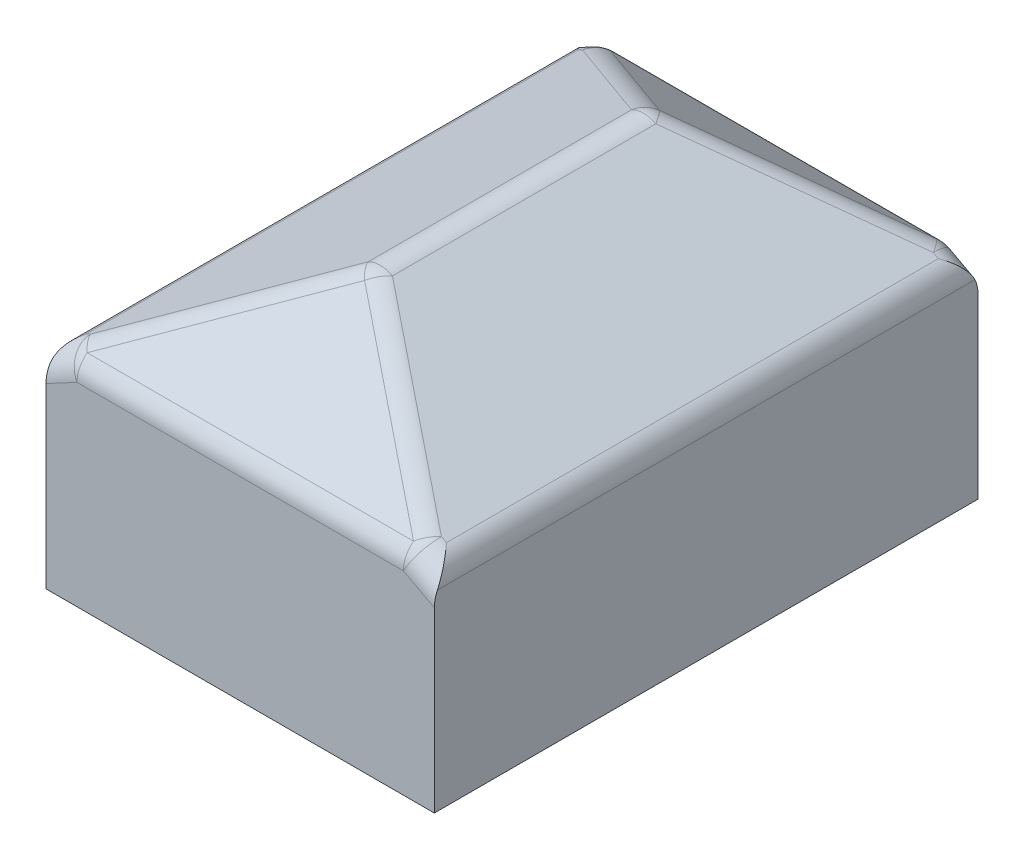
ISO-10303-21;
HEADER;
FILE_DESCRIPTION(('STEP AP214'),'2;1');
FILE_NAME('part.step','',(''),(''),'','','');
FILE_SCHEMA(('AUTOMOTIVE_DESIGN { 1 0 10303 214 1 1 1 1 }'));
ENDSEC;
DATA;
#1=APPLICATION_CONTEXT('core data for automotive mechanical design processes');
#2=APPLICATION_PROTOCOL_DEFINITION('international standard','automotive_design',2000,#1);
#3=PRODUCT_CONTEXT('',#1,'mechanical');
#4=PRODUCT('Part','Part','',(#3));
#5=PRODUCT_RELATED_PRODUCT_CATEGORY('part','',(#4));
#6=PRODUCT_DEFINITION_FORMATION('','',#4);
#7=PRODUCT_DEFINITION_CONTEXT('part definition',#1,'design');
#8=PRODUCT_DEFINITION('design','',#6,#7);
#9=PRODUCT_DEFINITION_SHAPE('','',#8);
#10=(LENGTH_UNIT() NAMED_UNIT(*) SI_UNIT(.MILLI.,.METRE.));
#11=(NAMED_UNIT(*) PLANE_ANGLE_UNIT() SI_UNIT($,.RADIAN.));
#12=(NAMED_UNIT(*) SI_UNIT($,.STERADIAN.) SOLID_ANGLE_UNIT());
#13=UNCERTAINTY_MEASURE_WITH_UNIT(LENGTH_MEASURE(1.E-05),#10,'distance_accuracy_value','');
#14=(GEOMETRIC_REPRESENTATION_CONTEXT(3) GLOBAL_UNCERTAINTY_ASSIGNED_CONTEXT((#13)) GLOBAL_UNIT_ASSIGNED_CONTEXT((#10,
#11,#12)) REPRESENTATION_CONTEXT('',''));
#15=CARTESIAN_POINT('',(0.,0.,0.));
#16=DIRECTION('',(0.,0.,1.));
#17=DIRECTION('',(1.,0.,0.));
#18=AXIS2_PLACEMENT_3D('',#15,#16,#17);
#19=CARTESIAN_POINT('',(75.,338.069758011279,-105.));
#20=DIRECTION('',(-1.,0.,0.));
#21=DIRECTION('',(0.,0.,1.));
#22=AXIS2_PLACEMENT_3D('',#19,#20,#21);
#23=PLANE('',#22);
#24=DIRECTION('',(0.,-1.,0.));
#25=VECTOR('',#24,1.);
#26=CARTESIAN_POINT('',(75.,338.069758011279,-105.));
#27=LINE('',#26,#25);
#28=CARTESIAN_POINT('',(75.,68.6666666666667,-105.));
#29=VERTEX_POINT('',#28);
#30=CARTESIAN_POINT('',(75.,0.,-105.));
#31=VERTEX_POINT('',#30);
#32=EDGE_CURVE('E186',#29,#31,#27,.T.);
#33=ORIENTED_EDGE('',*,*,#32,.F.);
#34=CARTESIAN_POINT('',(75.,68.6666666666667,-95.));
#35=DIRECTION('',(-1.,0.,0.));
#36=DIRECTION('',(0.,-1.,0.));
#37=AXIS2_PLACEMENT_3D('',#34,#35,#36);
#38=ELLIPSE('',#37,11.3333333333333,10.);
#39=CARTESIAN_POINT('',(75.,74.,-103.823529411765));
#40=VERTEX_POINT('',#39);
#41=EDGE_CURVE('E254',#29,#40,#38,.F.);
#42=ORIENTED_EDGE('',*,*,#41,.T.);
#43=DIRECTION('',(0.,0.,-1.));
#44=VECTOR('',#43,1.);
#45=CARTESIAN_POINT('',(75.,74.,-105.));
#46=LINE('',#45,#44);
#47=CARTESIAN_POINT('',(75.,74.,103.823529411765));
#48=VERTEX_POINT('',#47);
#49=EDGE_CURVE('E227',#40,#48,#46,.F.);
#50=ORIENTED_EDGE('',*,*,#49,.T.);
#51=CARTESIAN_POINT('',(75.,68.6666666666667,95.));
#52=DIRECTION('',(-1.,0.,0.));
#53=DIRECTION('',(0.,1.,0.));
#54=AXIS2_PLACEMENT_3D('',#51,#52,#53);
#55=ELLIPSE('',#54,11.3333333333333,10.);
#56=CARTESIAN_POINT('',(75.,68.6666666666667,105.));
#57=VERTEX_POINT('',#56);
#58=EDGE_CURVE('E167',#48,#57,#55,.F.);
#59=ORIENTED_EDGE('',*,*,#58,.T.);
#60=DIRECTION('',(0.,-1.,0.));
#61=VECTOR('',#60,1.);
#62=CARTESIAN_POINT('',(75.,338.069758011279,105.));
#63=LINE('',#62,#61);
#64=CARTESIAN_POINT('',(75.,0.,105.));
#65=VERTEX_POINT('',#64);
#66=EDGE_CURVE('E160',#57,#65,#63,.T.);
#67=ORIENTED_EDGE('',*,*,#66,.T.);
#68=DIRECTION('',(0.,0.,-1.));
#69=VECTOR('',#68,1.);
#70=CARTESIAN_POINT('',(75.,0.,-105.));
#71=LINE('',#70,#69);
#72=EDGE_CURVE('E164',#65,#31,#71,.T.);
#73=ORIENTED_EDGE('',*,*,#72,.T.);
#74=EDGE_LOOP('',(#33,#42,#50,#59,#67,#73));
#75=FACE_BOUND('',#74,.T.);
#76=ADVANCED_FACE('F39',(#75),#23,.F.);
#77=CARTESIAN_POINT('',(-75.,338.069758011279,-105.));
#78=DIRECTION('',(0.,0.,1.));
#79=DIRECTION('',(1.,0.,0.));
#80=AXIS2_PLACEMENT_3D('',#77,#78,#79);
#81=PLANE('',#80);
#82=DIRECTION('',(-1.,0.,0.));
#83=VECTOR('',#82,1.);
#84=CARTESIAN_POINT('',(68.6643447506093,75.0472583024342,-105.));
#85=LINE('',#84,#83);
#86=CARTESIAN_POINT('',(-63.0363906829358,75.0472583024342,-105.));
#87=VERTEX_POINT('',#86);
#88=CARTESIAN_POINT('',(63.0363906829359,75.0472583024342,-105.));
#89=VERTEX_POINT('',#88);
#90=EDGE_CURVE('E229',#87,#89,#85,.F.);
#91=ORIENTED_EDGE('',*,*,#90,.T.);
#92=DIRECTION('',(0.882352941176471,-0.470588235294118,0.));
#93=VECTOR('',#92,1.);
#94=CARTESIAN_POINT('',(-153.644882219216,190.610603850249,-105.));
#95=LINE('',#94,#93);
#96=EDGE_CURVE('E251',#89,#29,#95,.T.);
#97=ORIENTED_EDGE('',*,*,#96,.T.);
#98=ORIENTED_EDGE('',*,*,#32,.T.);
#99=DIRECTION('',(-1.,0.,0.));
#100=VECTOR('',#99,1.);
#101=CARTESIAN_POINT('',(-75.,0.,-105.));
#102=LINE('',#101,#100);
#103=CARTESIAN_POINT('',(-75.,0.,-105.));
#104=VERTEX_POINT('',#103);
#105=EDGE_CURVE('E185',#31,#104,#102,.T.);
#106=ORIENTED_EDGE('',*,*,#105,.T.);
#107=DIRECTION('',(0.,-1.,0.));
#108=VECTOR('',#107,1.);
#109=CARTESIAN_POINT('',(-75.,338.069758011279,-105.));
#110=LINE('',#109,#108);
#111=CARTESIAN_POINT('',(-75.,68.6666666666667,-105.));
#112=VERTEX_POINT('',#111);
#113=EDGE_CURVE('E192',#112,#104,#110,.T.);
#114=ORIENTED_EDGE('',*,*,#113,.F.);
#115=DIRECTION('',(0.882352941176471,0.470588235294118,0.));
#116=VECTOR('',#115,1.);
#117=CARTESIAN_POINT('',(36.8628752988009,128.326866826027,-105.));
#118=LINE('',#117,#116);
#119=EDGE_CURVE('E249',#112,#87,#118,.T.);
#120=ORIENTED_EDGE('',*,*,#119,.T.);
#121=EDGE_LOOP('',(#91,#97,#98,#106,#114,#120));
#122=FACE_BOUND('',#121,.T.);
#123=ADVANCED_FACE('F393',(#122),#81,.F.);
#124=CARTESIAN_POINT('',(-75.,338.069758011279,-105.));
#125=DIRECTION('',(1.,0.,0.));
#126=DIRECTION('',(0.,0.,-1.));
#127=AXIS2_PLACEMENT_3D('',#124,#125,#126);
#128=PLANE('',#127);
#129=DIRECTION('',(0.,0.,1.));
#130=VECTOR('',#129,1.);
#131=CARTESIAN_POINT('',(-75.,74.0000000000001,-105.));
#132=LINE('',#131,#130);
#133=CARTESIAN_POINT('',(-75.,74.0000000000001,103.823529411765));
#134=VERTEX_POINT('',#133);
#135=CARTESIAN_POINT('',(-75.,74.0000000000001,-103.823529411765));
#136=VERTEX_POINT('',#135);
#137=EDGE_CURVE('E214',#134,#136,#132,.F.);
#138=ORIENTED_EDGE('',*,*,#137,.T.);
#139=CARTESIAN_POINT('',(-75.,68.6666666666667,-95.));
#140=DIRECTION('',(1.,0.,0.));
#141=DIRECTION('',(0.,1.,0.));
#142=AXIS2_PLACEMENT_3D('',#139,#140,#141);
#143=ELLIPSE('',#142,11.3333333333333,10.);
#144=EDGE_CURVE('E279',#136,#112,#143,.F.);
#145=ORIENTED_EDGE('',*,*,#144,.T.);
#146=ORIENTED_EDGE('',*,*,#113,.T.);
#147=DIRECTION('',(0.,0.,1.));
#148=VECTOR('',#147,1.);
#149=CARTESIAN_POINT('',(-75.,0.,-105.));
#150=LINE('',#149,#148);
#151=CARTESIAN_POINT('',(-75.,0.,105.));
#152=VERTEX_POINT('',#151);
#153=EDGE_CURVE('E194',#104,#152,#150,.T.);
#154=ORIENTED_EDGE('',*,*,#153,.T.);
#155=DIRECTION('',(0.,-1.,0.));
#156=VECTOR('',#155,1.);
#157=CARTESIAN_POINT('',(-75.,338.069758011279,105.));
#158=LINE('',#157,#156);
#159=CARTESIAN_POINT('',(-75.,68.6666666666667,105.));
#160=VERTEX_POINT('',#159);
#161=EDGE_CURVE('E176',#160,#152,#158,.T.);
#162=ORIENTED_EDGE('',*,*,#161,.F.);
#163=CARTESIAN_POINT('',(-75.,68.6666666666667,95.));
#164=DIRECTION('',(1.,0.,0.));
#165=DIRECTION('',(0.,-1.,0.));
#166=AXIS2_PLACEMENT_3D('',#163,#164,#165);
#167=ELLIPSE('',#166,11.3333333333333,10.);
#168=EDGE_CURVE('E277',#160,#134,#167,.F.);
#169=ORIENTED_EDGE('',*,*,#168,.T.);
#170=EDGE_LOOP('',(#138,#145,#146,#154,#162,#169));
#171=FACE_BOUND('',#170,.T.);
#172=ADVANCED_FACE('F398',(#171),#128,.F.);
#173=CARTESIAN_POINT('',(-75.,338.069758011279,105.));
#174=DIRECTION('',(0.,0.,-1.));
#175=DIRECTION('',(-1.,0.,0.));
#176=AXIS2_PLACEMENT_3D('',#173,#174,#175);
#177=PLANE('',#176);
#178=DIRECTION('',(1.,0.,0.));
#179=VECTOR('',#178,1.);
#180=CARTESIAN_POINT('',(-75.,75.0472583024342,105.));
#181=LINE('',#180,#179);
#182=CARTESIAN_POINT('',(63.0363906829359,75.0472583024342,105.));
#183=VERTEX_POINT('',#182);
#184=CARTESIAN_POINT('',(-63.0363906829359,75.0472583024342,105.));
#185=VERTEX_POINT('',#184);
#186=EDGE_CURVE('E281',#183,#185,#181,.F.);
#187=ORIENTED_EDGE('',*,*,#186,.T.);
#188=DIRECTION('',(-0.882352941176471,-0.470588235294118,0.));
#189=VECTOR('',#188,1.);
#190=CARTESIAN_POINT('',(36.8628752988009,128.326866826027,105.));
#191=LINE('',#190,#189);
#192=EDGE_CURVE('E285',#185,#160,#191,.T.);
#193=ORIENTED_EDGE('',*,*,#192,.T.);
#194=ORIENTED_EDGE('',*,*,#161,.T.);
#195=DIRECTION('',(1.,0.,0.));
#196=VECTOR('',#195,1.);
#197=CARTESIAN_POINT('',(-75.,0.,105.));
#198=LINE('',#197,#196);
#199=EDGE_CURVE('E173',#152,#65,#198,.T.);
#200=ORIENTED_EDGE('',*,*,#199,.T.);
#201=ORIENTED_EDGE('',*,*,#66,.F.);
#202=DIRECTION('',(-0.882352941176471,0.470588235294118,0.));
#203=VECTOR('',#202,1.);
#204=CARTESIAN_POINT('',(-153.644882219216,190.610603850249,105.));
#205=LINE('',#204,#203);
#206=EDGE_CURVE('E283',#57,#183,#205,.T.);
#207=ORIENTED_EDGE('',*,*,#206,.T.);
#208=EDGE_LOOP('',(#187,#193,#194,#200,#201,#207));
#209=FACE_BOUND('',#208,.T.);
#210=ADVANCED_FACE('F174',(#209),#177,.F.);
#211=CARTESIAN_POINT('',(0.,0.,0.));
#212=DIRECTION('',(0.,1.,0.));
#213=DIRECTION('',(0.,0.,1.));
#214=AXIS2_PLACEMENT_3D('',#211,#212,#213);
#215=PLANE('',#214);
#216=ORIENTED_EDGE('',*,*,#72,.F.);
#217=ORIENTED_EDGE('',*,*,#199,.F.);
#218=ORIENTED_EDGE('',*,*,#153,.F.);
#219=ORIENTED_EDGE('',*,*,#105,.F.);
#220=EDGE_LOOP('',(#216,#217,#218,#219));
#221=FACE_BOUND('',#220,.T.);
#222=ADVANCED_FACE('F183',(#221),#215,.F.);
#223=CARTESIAN_POINT('',(75.,80.,284.448989903466));
#224=DIRECTION('',(-0.470588235294118,-0.88235294117647,0.));
#225=DIRECTION('',(0.882352941176471,-0.470588235294118,0.));
#226=AXIS2_PLACEMENT_3D('',#223,#224,#225);
#227=PLANE('',#226);
#228=DIRECTION('',(0.,0.,-1.));
#229=VECTOR('',#228,1.);
#230=CARTESIAN_POINT('',(69.7058823529412,82.8235294117647,284.448989903466));
#231=LINE('',#230,#229);
#232=CARTESIAN_POINT('',(69.7058823529412,82.8235294117647,95.));
#233=VERTEX_POINT('',#232);
#234=CARTESIAN_POINT('',(69.7058823529412,82.8235294117647,-95.));
#235=VERTEX_POINT('',#234);
#236=EDGE_CURVE('E222',#233,#235,#231,.T.);
#237=ORIENTED_EDGE('',*,*,#236,.T.);
#238=DIRECTION('',(0.882352941176471,-0.470588235294118,0.));
#239=VECTOR('',#238,1.);
#240=CARTESIAN_POINT('',(75.,80.,-95.));
#241=LINE('',#240,#239);
#242=CARTESIAN_POINT('',(67.7422730358771,83.8707877141989,-95.));
#243=VERTEX_POINT('',#242);
#244=EDGE_CURVE('E262',#235,#243,#241,.F.);
#245=ORIENTED_EDGE('',*,*,#244,.T.);
#246=DIRECTION('',(-0.750704115317023,0.400375528169079,0.525492880721916));
#247=VECTOR('',#246,1.);
#248=CARTESIAN_POINT('',(1.9407278702704,118.964945135856,-48.9389183840753));
#249=LINE('',#248,#247);
#250=CARTESIAN_POINT('',(4.70588235294117,117.490196078431,-50.8745265219448));
#251=VERTEX_POINT('',#250);
#252=EDGE_CURVE('E225',#243,#251,#249,.T.);
#253=ORIENTED_EDGE('',*,*,#252,.T.);
#254=DIRECTION('',(0.,0.,-1.));
#255=VECTOR('',#254,1.);
#256=CARTESIAN_POINT('',(4.70588235294117,117.490196078431,284.448989903466));
#257=LINE('',#256,#255);
#258=CARTESIAN_POINT('',(4.70588235294117,117.490196078431,50.8745265219449));
#259=VERTEX_POINT('',#258);
#260=EDGE_CURVE('E217',#251,#259,#257,.F.);
#261=ORIENTED_EDGE('',*,*,#260,.T.);
#262=DIRECTION('',(0.750704115317023,-0.400375528169079,0.525492880721916));
#263=VECTOR('',#262,1.);
#264=CARTESIAN_POINT('',(147.731500343147,41.209866483655,150.992459115089));
#265=LINE('',#264,#263);
#266=CARTESIAN_POINT('',(67.742273035877,83.8707877141989,95.));
#267=VERTEX_POINT('',#266);
#268=EDGE_CURVE('E219',#259,#267,#265,.T.);
#269=ORIENTED_EDGE('',*,*,#268,.T.);
#270=DIRECTION('',(-0.882352941176471,0.470588235294118,0.));
#271=VECTOR('',#270,1.);
#272=CARTESIAN_POINT('',(75.,80.,95.));
#273=LINE('',#272,#271);
#274=EDGE_CURVE('E260',#267,#233,#273,.F.);
#275=ORIENTED_EDGE('',*,*,#274,.T.);
#276=EDGE_LOOP('',(#237,#245,#253,#261,#269,#275));
#277=FACE_BOUND('',#276,.T.);
#278=ADVANCED_FACE('F320',(#277),#227,.F.);
#279=CARTESIAN_POINT('',(0.,120.,284.448989903466));
#280=DIRECTION('',(0.470588235294118,-0.882352941176471,0.));
#281=DIRECTION('',(0.882352941176471,0.470588235294118,0.));
#282=AXIS2_PLACEMENT_3D('',#279,#280,#281);
#283=PLANE('',#282);
#284=DIRECTION('',(-0.750704115317023,-0.400375528169079,-0.525492880721916));
#285=VECTOR('',#284,1.);
#286=CARTESIAN_POINT('',(-76.9407278702704,78.9649451358558,-101.438918384075));
#287=LINE('',#286,#285);
#288=CARTESIAN_POINT('',(-4.70588235294118,117.490196078431,-50.8745265219449));
#289=VERTEX_POINT('',#288);
#290=CARTESIAN_POINT('',(-67.742273035877,83.870787714199,-95.));
#291=VERTEX_POINT('',#290);
#292=EDGE_CURVE('E199',#289,#291,#287,.T.);
#293=ORIENTED_EDGE('',*,*,#292,.T.);
#294=DIRECTION('',(0.882352941176471,0.470588235294118,0.));
#295=VECTOR('',#294,1.);
#296=CARTESIAN_POINT('',(0.,120.,-95.));
#297=LINE('',#296,#295);
#298=CARTESIAN_POINT('',(-69.7058823529412,82.8235294117647,-95.));
#299=VERTEX_POINT('',#298);
#300=EDGE_CURVE('E271',#291,#299,#297,.F.);
#301=ORIENTED_EDGE('',*,*,#300,.T.);
#302=DIRECTION('',(0.,0.,1.));
#303=VECTOR('',#302,1.);
#304=CARTESIAN_POINT('',(-69.7058823529411,82.8235294117648,284.448989903466));
#305=LINE('',#304,#303);
#306=CARTESIAN_POINT('',(-69.7058823529412,82.8235294117648,95.));
#307=VERTEX_POINT('',#306);
#308=EDGE_CURVE('E202',#299,#307,#305,.T.);
#309=ORIENTED_EDGE('',*,*,#308,.T.);
#310=DIRECTION('',(-0.882352941176471,-0.470588235294118,0.));
#311=VECTOR('',#310,1.);
#312=CARTESIAN_POINT('',(0.,120.,95.));
#313=LINE('',#312,#311);
#314=CARTESIAN_POINT('',(-67.7422730358771,83.8707877141989,95.));
#315=VERTEX_POINT('',#314);
#316=EDGE_CURVE('E269',#307,#315,#313,.F.);
#317=ORIENTED_EDGE('',*,*,#316,.T.);
#318=DIRECTION('',(0.750704115317023,0.400375528169079,-0.525492880721916));
#319=VECTOR('',#318,1.);
#320=CARTESIAN_POINT('',(-93.4422079198532,70.1641557760783,112.989954418783));
#321=LINE('',#320,#319);
#322=CARTESIAN_POINT('',(-4.70588235294118,117.490196078431,50.8745265219449));
#323=VERTEX_POINT('',#322);
#324=EDGE_CURVE('E197',#315,#323,#321,.T.);
#325=ORIENTED_EDGE('',*,*,#324,.T.);
#326=DIRECTION('',(0.,0.,-1.));
#327=VECTOR('',#326,1.);
#328=CARTESIAN_POINT('',(-4.70588235294118,117.490196078431,284.448989903466));
#329=LINE('',#328,#327);
#330=EDGE_CURVE('E180',#323,#289,#329,.T.);
#331=ORIENTED_EDGE('',*,*,#330,.T.);
#332=EDGE_LOOP('',(#293,#301,#309,#317,#325,#331));
#333=FACE_BOUND('',#332,.T.);
#334=ADVANCED_FACE('F366',(#333),#283,.F.);
#335=CARTESIAN_POINT('',(0.,101.233859397418,77.1305595408895));
#336=DIRECTION('',(0.,-0.795431720032499,-0.606043215262856));
#337=DIRECTION('',(0.,0.606043215262856,-0.795431720032499));
#338=AXIS2_PLACEMENT_3D('',#335,#336,#337);
#339=PLANE('',#338);
#340=DIRECTION('',(0.750704115317023,0.400375528169079,-0.525492880721916));
#341=VECTOR('',#340,1.);
#342=CARTESIAN_POINT('',(-12.5917647408733,109.905376005193,65.7491939931848));
#343=LINE('',#342,#341);
#344=CARTESIAN_POINT('',(0.,116.620983866992,56.9349586745734));
#345=VERTEX_POINT('',#344);
#346=CARTESIAN_POINT('',(-63.0363906829359,83.0015755027592,101.060432152629));
#347=VERTEX_POINT('',#346);
#348=EDGE_CURVE('E212',#345,#347,#343,.F.);
#349=ORIENTED_EDGE('',*,*,#348,.T.);
#350=DIRECTION('',(1.,0.,0.));
#351=VECTOR('',#350,1.);
#352=CARTESIAN_POINT('',(0.,83.0015755027592,101.060432152629));
#353=LINE('',#352,#351);
#354=CARTESIAN_POINT('',(63.0363906829359,83.0015755027592,101.060432152629));
#355=VERTEX_POINT('',#354);
#356=EDGE_CURVE('E11',#347,#355,#353,.T.);
#357=ORIENTED_EDGE('',*,*,#356,.T.);
#358=DIRECTION('',(0.750704115317023,-0.400375528169079,0.525492880721916));
#359=VECTOR('',#358,1.);
#360=CARTESIAN_POINT('',(12.5917647408733,109.905376005193,65.7491939931848));
#361=LINE('',#360,#359);
#362=EDGE_CURVE('E210',#355,#345,#361,.F.);
#363=ORIENTED_EDGE('',*,*,#362,.T.);
#364=EDGE_LOOP('',(#349,#357,#363));
#365=FACE_BOUND('',#364,.T.);
#366=ADVANCED_FACE('F560',(#365),#339,.F.);
#367=CARTESIAN_POINT('',(0.,101.233859397418,-77.1305595408895));
#368=DIRECTION('',(0.,0.795431720032499,-0.606043215262856));
#369=DIRECTION('',(0.,0.606043215262856,0.795431720032499));
#370=AXIS2_PLACEMENT_3D('',#367,#368,#369);
#371=PLANE('',#370);
#372=DIRECTION('',(-0.750704115317023,0.400375528169079,0.525492880721916));
#373=VECTOR('',#372,1.);
#374=CARTESIAN_POINT('',(72.2348455173292,78.0957329244161,-107.499350536704));
#375=LINE('',#374,#373);
#376=CARTESIAN_POINT('',(0.,116.620983866992,-56.9349586745735));
#377=VERTEX_POINT('',#376);
#378=CARTESIAN_POINT('',(63.0363906829359,83.0015755027592,-101.060432152629));
#379=VERTEX_POINT('',#378);
#380=EDGE_CURVE('E205',#377,#379,#375,.F.);
#381=ORIENTED_EDGE('',*,*,#380,.T.);
#382=DIRECTION('',(-1.,0.,0.));
#383=VECTOR('',#382,1.);
#384=CARTESIAN_POINT('',(-68.6643447506093,83.0015755027592,-101.060432152629));
#385=LINE('',#384,#383);
#386=CARTESIAN_POINT('',(-63.0363906829358,83.0015755027592,-101.060432152629));
#387=VERTEX_POINT('',#386);
#388=EDGE_CURVE('E48',#379,#387,#385,.T.);
#389=ORIENTED_EDGE('',*,*,#388,.T.);
#390=DIRECTION('',(-0.750704115317023,-0.400375528169079,-0.525492880721916));
#391=VECTOR('',#390,1.);
#392=CARTESIAN_POINT('',(2.76515448267084,118.095732924416,-54.9993505367039));
#393=LINE('',#392,#391);
#394=EDGE_CURVE('E208',#387,#377,#393,.F.);
#395=ORIENTED_EDGE('',*,*,#394,.T.);
#396=EDGE_LOOP('',(#381,#389,#395));
#397=FACE_BOUND('',#396,.T.);
#398=ADVANCED_FACE('F349',(#397),#371,.T.);
#399=CARTESIAN_POINT('',(143.025617990206,32.3863370718903,150.992459115089));
#400=DIRECTION('',(0.750704115317023,-0.400375528169079,0.525492880721916));
#401=DIRECTION('',(0.573462344363328,0.,-0.819231920519041));
#402=AXIS2_PLACEMENT_3D('',#399,#400,#401);
#403=CYLINDRICAL_SURFACE('',#402,10.);
#404=ORIENTED_EDGE('',*,*,#362,.F.);
#405=CARTESIAN_POINT('',(63.0363906829359,75.0472583024342,95.));
#406=DIRECTION('',(0.750704115317023,-0.400375528169079,0.525492880721916));
#407=DIRECTION('',(0.573462344363328,0.,-0.819231920519041));
#408=AXIS2_PLACEMENT_3D('',#405,#406,#407);
#409=CIRCLE('',#408,10.);
#410=EDGE_CURVE('E290',#355,#267,#409,.F.);
#411=ORIENTED_EDGE('',*,*,#410,.T.);
#412=ORIENTED_EDGE('',*,*,#268,.F.);
#413=CARTESIAN_POINT('',(0.,108.666666666667,50.8745265219449));
#414=DIRECTION('',(-0.75070411531702,0.400375528169081,-0.525492880721918));
#415=DIRECTION('',(-0.573462344363331,0.,0.819231920519038));
#416=AXIS2_PLACEMENT_3D('',#413,#414,#415);
#417=CIRCLE('',#416,10.);
#418=EDGE_CURVE('E170',#345,#259,#417,.T.);
#419=ORIENTED_EDGE('',*,*,#418,.F.);
#420=EDGE_LOOP('',(#404,#411,#412,#419));
#421=FACE_BOUND('',#420,.T.);
#422=ADVANCED_FACE('F425',(#421),#403,.T.);
#423=CARTESIAN_POINT('',(65.,74.,284.448989903466));
#424=DIRECTION('',(0.,0.,-1.));
#425=DIRECTION('',(-1.,0.,0.));
#426=AXIS2_PLACEMENT_3D('',#423,#424,#425);
#427=CYLINDRICAL_SURFACE('',#426,10.);
#428=ORIENTED_EDGE('',*,*,#49,.F.);
#429=CARTESIAN_POINT('',(65.,74.,-95.));
#430=DIRECTION('',(-0.623917748105777,0.332756132323081,-0.707106781186547));
#431=DIRECTION('',(0.623917748105777,-0.332756132323081,-0.707106781186547));
#432=AXIS2_PLACEMENT_3D('',#429,#430,#431);
#433=ELLIPSE('',#432,14.1421356237309,10.);
#434=EDGE_CURVE('E258',#40,#235,#433,.F.);
#435=ORIENTED_EDGE('',*,*,#434,.T.);
#436=ORIENTED_EDGE('',*,*,#236,.F.);
#437=CARTESIAN_POINT('',(65.,74.,95.));
#438=DIRECTION('',(0.623917748105777,-0.332756132323081,-0.707106781186547));
#439=DIRECTION('',(-0.623917748105777,0.332756132323081,-0.707106781186547));
#440=AXIS2_PLACEMENT_3D('',#437,#438,#439);
#441=ELLIPSE('',#440,14.1421356237309,10.);
#442=EDGE_CURVE('E256',#233,#48,#441,.T.);
#443=ORIENTED_EDGE('',*,*,#442,.T.);
#444=EDGE_LOOP('',(#428,#435,#436,#443));
#445=FACE_BOUND('',#444,.T.);
#446=ADVANCED_FACE('F325',(#445),#427,.T.);
#447=CARTESIAN_POINT('',(0.,108.666666666667,50.8745265219449));
#448=DIRECTION('',(0.,0.,1.));
#449=DIRECTION('',(1.,0.,0.));
#450=AXIS2_PLACEMENT_3D('',#447,#448,#449);
#451=SPHERICAL_SURFACE('',#450,10.);
#452=CARTESIAN_POINT('',(0.,108.666666666667,50.8745265219449));
#453=DIRECTION('',(0.750704115317023,0.400375528169079,-0.525492880721915));
#454=DIRECTION('',(-0.573462344363328,0.,-0.819231920519041));
#455=AXIS2_PLACEMENT_3D('',#452,#453,#454);
#456=CIRCLE('',#455,10.);
#457=EDGE_CURVE('E240',#345,#323,#456,.F.);
#458=ORIENTED_EDGE('',*,*,#457,.F.);
#459=ORIENTED_EDGE('',*,*,#418,.T.);
#460=CARTESIAN_POINT('',(0.,108.666666666667,50.8745265219449));
#461=DIRECTION('',(0.,0.,1.));
#462=DIRECTION('',(1.,0.,0.));
#463=AXIS2_PLACEMENT_3D('',#460,#461,#462);
#464=CIRCLE('',#463,10.);
#465=EDGE_CURVE('E243',#323,#259,#464,.F.);
#466=ORIENTED_EDGE('',*,*,#465,.F.);
#467=EDGE_LOOP('',(#458,#459,#466));
#468=FACE_BOUND('',#467,.T.);
#469=ADVANCED_FACE('F419',(#468),#451,.T.);
#470=CARTESIAN_POINT('',(-81.3987572623727,152.079337206599,6.10460356171605));
#471=DIRECTION('',(0.750704115317023,-0.400375528169079,-0.525492880721916));
#472=DIRECTION('',(-0.573462344363329,0.,-0.81923192051904));
#473=AXIS2_PLACEMENT_3D('',#470,#471,#472);
#474=CYLINDRICAL_SURFACE('',#473,10.);
#475=ORIENTED_EDGE('',*,*,#252,.F.);
#476=CARTESIAN_POINT('',(63.0363906829359,75.0472583024342,-95.));
#477=DIRECTION('',(0.750704115317023,-0.400375528169079,-0.525492880721916));
#478=DIRECTION('',(-0.573462344363329,0.,-0.81923192051904));
#479=AXIS2_PLACEMENT_3D('',#476,#477,#478);
#480=CIRCLE('',#479,10.);
#481=EDGE_CURVE('E264',#243,#379,#480,.F.);
#482=ORIENTED_EDGE('',*,*,#481,.T.);
#483=ORIENTED_EDGE('',*,*,#380,.F.);
#484=CARTESIAN_POINT('',(0.,108.666666666667,-50.8745265219448));
#485=DIRECTION('',(-0.750704115317028,0.400375528169082,0.525492880721905));
#486=DIRECTION('',(0.573462344363318,0.,0.819231920519048));
#487=AXIS2_PLACEMENT_3D('',#484,#485,#486);
#488=CIRCLE('',#487,10.);
#489=EDGE_CURVE('E237',#251,#377,#488,.T.);
#490=ORIENTED_EDGE('',*,*,#489,.F.);
#491=EDGE_LOOP('',(#475,#482,#483,#490));
#492=FACE_BOUND('',#491,.T.);
#493=ADVANCED_FACE('F336',(#492),#474,.T.);
#494=CARTESIAN_POINT('',(0.,108.666666666667,284.448989903466));
#495=DIRECTION('',(0.,0.,-1.));
#496=DIRECTION('',(-1.,0.,0.));
#497=AXIS2_PLACEMENT_3D('',#494,#495,#496);
#498=CYLINDRICAL_SURFACE('',#497,10.);
#499=ORIENTED_EDGE('',*,*,#465,.T.);
#500=ORIENTED_EDGE('',*,*,#260,.F.);
#501=CARTESIAN_POINT('',(0.,108.666666666667,-50.8745265219449));
#502=DIRECTION('',(0.,0.,-1.));
#503=DIRECTION('',(-1.,0.,0.));
#504=AXIS2_PLACEMENT_3D('',#501,#502,#503);
#505=CIRCLE('',#504,10.);
#506=EDGE_CURVE('E233',#289,#251,#505,.T.);
#507=ORIENTED_EDGE('',*,*,#506,.F.);
#508=ORIENTED_EDGE('',*,*,#330,.F.);
#509=EDGE_LOOP('',(#499,#500,#507,#508));
#510=FACE_BOUND('',#509,.T.);
#511=ADVANCED_FACE('F413',(#510),#498,.T.);
#512=CARTESIAN_POINT('',(-88.7363255669121,61.3406263643136,112.989954418783));
#513=DIRECTION('',(0.750704115317023,0.400375528169079,-0.525492880721916));
#514=DIRECTION('',(-0.573462344363328,0.,-0.819231920519041));
#515=AXIS2_PLACEMENT_3D('',#512,#513,#514);
#516=CYLINDRICAL_SURFACE('',#515,10.);
#517=ORIENTED_EDGE('',*,*,#324,.F.);
#518=CARTESIAN_POINT('',(-63.0363906829359,75.0472583024342,95.));
#519=DIRECTION('',(0.750704115317023,0.400375528169079,-0.525492880721916));
#520=DIRECTION('',(-0.573462344363328,0.,-0.819231920519041));
#521=AXIS2_PLACEMENT_3D('',#518,#519,#520);
#522=CIRCLE('',#521,10.);
#523=EDGE_CURVE('E287',#315,#347,#522,.T.);
#524=ORIENTED_EDGE('',*,*,#523,.T.);
#525=ORIENTED_EDGE('',*,*,#348,.F.);
#526=ORIENTED_EDGE('',*,*,#457,.T.);
#527=EDGE_LOOP('',(#517,#524,#525,#526));
#528=FACE_BOUND('',#527,.T.);
#529=ADVANCED_FACE('F379',(#528),#516,.T.);
#530=CARTESIAN_POINT('',(0.,108.666666666667,-50.8745265219449));
#531=DIRECTION('',(0.,0.,1.));
#532=DIRECTION('',(1.,0.,0.));
#533=AXIS2_PLACEMENT_3D('',#530,#531,#532);
#534=SPHERICAL_SURFACE('',#533,10.);
#535=ORIENTED_EDGE('',*,*,#506,.T.);
#536=ORIENTED_EDGE('',*,*,#489,.T.);
#537=CARTESIAN_POINT('',(0.,108.666666666667,-50.8745265219449));
#538=DIRECTION('',(0.750704115317016,0.400375528169084,0.525492880721922));
#539=DIRECTION('',(0.573462344363336,0.,-0.819231920519035));
#540=AXIS2_PLACEMENT_3D('',#537,#538,#539);
#541=CIRCLE('',#540,10.);
#542=EDGE_CURVE('E230',#289,#377,#541,.F.);
#543=ORIENTED_EDGE('',*,*,#542,.F.);
#544=EDGE_LOOP('',(#535,#536,#543));
#545=FACE_BOUND('',#544,.T.);
#546=ADVANCED_FACE('F407',(#545),#534,.T.);
#547=CARTESIAN_POINT('',(-65.,74.0000000000001,284.448989903466));
#548=DIRECTION('',(0.,0.,1.));
#549=DIRECTION('',(1.,0.,0.));
#550=AXIS2_PLACEMENT_3D('',#547,#548,#549);
#551=CYLINDRICAL_SURFACE('',#550,10.);
#552=ORIENTED_EDGE('',*,*,#308,.F.);
#553=CARTESIAN_POINT('',(-65.,74.,-94.9999999999999));
#554=DIRECTION('',(-0.623917748105777,-0.332756132323081,0.707106781186547));
#555=DIRECTION('',(0.623917748105777,0.332756132323081,0.707106781186547));
#556=AXIS2_PLACEMENT_3D('',#553,#554,#555);
#557=ELLIPSE('',#556,14.142135623731,10.);
#558=EDGE_CURVE('E275',#299,#136,#557,.T.);
#559=ORIENTED_EDGE('',*,*,#558,.T.);
#560=ORIENTED_EDGE('',*,*,#137,.F.);
#561=CARTESIAN_POINT('',(-65.,74.,95.0000000000001));
#562=DIRECTION('',(0.623917748105777,0.332756132323081,0.707106781186547));
#563=DIRECTION('',(-0.623917748105777,-0.332756132323081,0.707106781186547));
#564=AXIS2_PLACEMENT_3D('',#561,#562,#563);
#565=ELLIPSE('',#564,14.1421356237309,10.);
#566=EDGE_CURVE('E273',#134,#307,#565,.F.);
#567=ORIENTED_EDGE('',*,*,#566,.T.);
#568=EDGE_LOOP('',(#552,#559,#560,#567));
#569=FACE_BOUND('',#568,.T.);
#570=ADVANCED_FACE('F369',(#569),#551,.T.);
#571=CARTESIAN_POINT('',(135.688049685666,181.033626499022,44.1071082580215));
#572=DIRECTION('',(0.750704115317023,0.400375528169079,0.525492880721916));
#573=DIRECTION('',(0.573462344363328,0.,-0.819231920519041));
#574=AXIS2_PLACEMENT_3D('',#571,#572,#573);
#575=CYLINDRICAL_SURFACE('',#574,10.);
#576=ORIENTED_EDGE('',*,*,#394,.F.);
#577=CARTESIAN_POINT('',(-63.0363906829358,75.0472583024342,-95.));
#578=DIRECTION('',(0.750704115317023,0.400375528169079,0.525492880721916));
#579=DIRECTION('',(0.573462344363328,0.,-0.819231920519041));
#580=AXIS2_PLACEMENT_3D('',#577,#578,#579);
#581=CIRCLE('',#580,10.);
#582=EDGE_CURVE('E267',#387,#291,#581,.T.);
#583=ORIENTED_EDGE('',*,*,#582,.T.);
#584=ORIENTED_EDGE('',*,*,#292,.F.);
#585=ORIENTED_EDGE('',*,*,#542,.T.);
#586=EDGE_LOOP('',(#576,#583,#584,#585));
#587=FACE_BOUND('',#586,.T.);
#588=ADVANCED_FACE('F352',(#587),#575,.T.);
#589=CARTESIAN_POINT('',(36.8628752988009,128.326866826027,-95.));
#590=DIRECTION('',(0.882352941176471,0.470588235294118,0.));
#591=DIRECTION('',(-0.470588235294118,0.882352941176471,0.));
#592=AXIS2_PLACEMENT_3D('',#589,#590,#591);
#593=CYLINDRICAL_SURFACE('',#592,10.);
#594=ORIENTED_EDGE('',*,*,#558,.F.);
#595=ORIENTED_EDGE('',*,*,#300,.F.);
#596=CARTESIAN_POINT('',(-63.0363906829359,75.0472583024342,-95.));
#597=DIRECTION('',(0.882352941176471,0.470588235294116,0.));
#598=DIRECTION('',(-0.470588235294116,0.882352941176471,0.));
#599=AXIS2_PLACEMENT_3D('',#596,#597,#598);
#600=CIRCLE('',#599,10.);
#601=EDGE_CURVE('E234',#87,#291,#600,.T.);
#602=ORIENTED_EDGE('',*,*,#601,.F.);
#603=ORIENTED_EDGE('',*,*,#119,.F.);
#604=ORIENTED_EDGE('',*,*,#144,.F.);
#605=EDGE_LOOP('',(#594,#595,#602,#603,#604));
#606=FACE_BOUND('',#605,.T.);
#607=ADVANCED_FACE('F362',(#606),#593,.T.);
#608=CARTESIAN_POINT('',(-63.0363906829358,75.0472583024342,-95.));
#609=DIRECTION('',(0.,0.,1.));
#610=DIRECTION('',(1.,0.,0.));
#611=AXIS2_PLACEMENT_3D('',#608,#609,#610);
#612=SPHERICAL_SURFACE('',#611,10.);
#613=ORIENTED_EDGE('',*,*,#601,.T.);
#614=ORIENTED_EDGE('',*,*,#582,.F.);
#615=CARTESIAN_POINT('',(-63.0363906829358,75.0472583024342,-95.));
#616=DIRECTION('',(1.,0.,0.));
#617=DIRECTION('',(0.,0.,-1.));
#618=AXIS2_PLACEMENT_3D('',#615,#616,#617);
#619=CIRCLE('',#618,10.);
#620=EDGE_CURVE('E298',#87,#387,#619,.T.);
#621=ORIENTED_EDGE('',*,*,#620,.F.);
#622=EDGE_LOOP('',(#613,#614,#621));
#623=FACE_BOUND('',#622,.T.);
#624=ADVANCED_FACE('F356',(#623),#612,.T.);
#625=CARTESIAN_POINT('',(0.,75.0472583024342,-95.));
#626=DIRECTION('',(1.,0.,0.));
#627=DIRECTION('',(0.,0.,-1.));
#628=AXIS2_PLACEMENT_3D('',#625,#626,#627);
#629=CYLINDRICAL_SURFACE('',#628,10.);
#630=ORIENTED_EDGE('',*,*,#620,.T.);
#631=ORIENTED_EDGE('',*,*,#388,.F.);
#632=CARTESIAN_POINT('',(63.0363906829359,75.0472583024342,-95.));
#633=DIRECTION('',(1.,0.,0.));
#634=DIRECTION('',(0.,0.,-1.));
#635=AXIS2_PLACEMENT_3D('',#632,#633,#634);
#636=CIRCLE('',#635,10.);
#637=EDGE_CURVE('E296',#89,#379,#636,.T.);
#638=ORIENTED_EDGE('',*,*,#637,.F.);
#639=ORIENTED_EDGE('',*,*,#90,.F.);
#640=EDGE_LOOP('',(#630,#631,#638,#639));
#641=FACE_BOUND('',#640,.T.);
#642=ADVANCED_FACE('F345',(#641),#629,.T.);
#643=CARTESIAN_POINT('',(-153.644882219216,190.610603850249,-95.));
#644=DIRECTION('',(0.882352941176471,-0.470588235294118,0.));
#645=DIRECTION('',(0.470588235294118,0.882352941176471,0.));
#646=AXIS2_PLACEMENT_3D('',#643,#644,#645);
#647=CYLINDRICAL_SURFACE('',#646,10.);
#648=ORIENTED_EDGE('',*,*,#41,.F.);
#649=ORIENTED_EDGE('',*,*,#96,.F.);
#650=CARTESIAN_POINT('',(63.0363906829359,75.0472583024342,-95.));
#651=DIRECTION('',(-0.882352941176471,0.470588235294117,0.));
#652=DIRECTION('',(-0.470588235294117,-0.882352941176471,0.));
#653=AXIS2_PLACEMENT_3D('',#650,#651,#652);
#654=CIRCLE('',#653,10.);
#655=EDGE_CURVE('E293',#243,#89,#654,.T.);
#656=ORIENTED_EDGE('',*,*,#655,.F.);
#657=ORIENTED_EDGE('',*,*,#244,.F.);
#658=ORIENTED_EDGE('',*,*,#434,.F.);
#659=EDGE_LOOP('',(#648,#649,#656,#657,#658));
#660=FACE_BOUND('',#659,.T.);
#661=ADVANCED_FACE('F329',(#660),#647,.T.);
#662=CARTESIAN_POINT('',(63.0363906829359,75.0472583024342,-95.));
#663=DIRECTION('',(0.,0.,1.));
#664=DIRECTION('',(1.,0.,0.));
#665=AXIS2_PLACEMENT_3D('',#662,#663,#664);
#666=SPHERICAL_SURFACE('',#665,10.);
#667=ORIENTED_EDGE('',*,*,#637,.T.);
#668=ORIENTED_EDGE('',*,*,#481,.F.);
#669=ORIENTED_EDGE('',*,*,#655,.T.);
#670=EDGE_LOOP('',(#667,#668,#669));
#671=FACE_BOUND('',#670,.T.);
#672=ADVANCED_FACE('F340',(#671),#666,.T.);
#673=CARTESIAN_POINT('',(-153.644882219216,190.610603850249,95.));
#674=DIRECTION('',(-0.882352941176471,0.470588235294118,0.));
#675=DIRECTION('',(-0.470588235294118,-0.882352941176471,0.));
#676=AXIS2_PLACEMENT_3D('',#673,#674,#675);
#677=CYLINDRICAL_SURFACE('',#676,10.);
#678=ORIENTED_EDGE('',*,*,#442,.F.);
#679=ORIENTED_EDGE('',*,*,#274,.F.);
#680=CARTESIAN_POINT('',(63.0363906829359,75.0472583024342,95.));
#681=DIRECTION('',(-0.88235294117647,0.470588235294119,0.));
#682=DIRECTION('',(-0.470588235294119,-0.88235294117647,0.));
#683=AXIS2_PLACEMENT_3D('',#680,#681,#682);
#684=CIRCLE('',#683,10.);
#685=EDGE_CURVE('E43',#183,#267,#684,.T.);
#686=ORIENTED_EDGE('',*,*,#685,.F.);
#687=ORIENTED_EDGE('',*,*,#206,.F.);
#688=ORIENTED_EDGE('',*,*,#58,.F.);
#689=EDGE_LOOP('',(#678,#679,#686,#687,#688));
#690=FACE_BOUND('',#689,.T.);
#691=ADVANCED_FACE('F41',(#690),#677,.T.);
#692=CARTESIAN_POINT('',(63.0363906829359,75.0472583024342,95.));
#693=DIRECTION('',(0.,0.,-1.));
#694=DIRECTION('',(-1.,0.,0.));
#695=AXIS2_PLACEMENT_3D('',#692,#693,#694);
#696=SPHERICAL_SURFACE('',#695,10.);
#697=ORIENTED_EDGE('',*,*,#685,.T.);
#698=ORIENTED_EDGE('',*,*,#410,.F.);
#699=CARTESIAN_POINT('',(63.0363906829359,75.0472583024342,95.));
#700=DIRECTION('',(-1.,0.,0.));
#701=DIRECTION('',(0.,-1.,0.));
#702=AXIS2_PLACEMENT_3D('',#699,#700,#701);
#703=CIRCLE('',#702,10.);
#704=EDGE_CURVE('E305',#183,#355,#703,.T.);
#705=ORIENTED_EDGE('',*,*,#704,.F.);
#706=EDGE_LOOP('',(#697,#698,#705));
#707=FACE_BOUND('',#706,.T.);
#708=ADVANCED_FACE('F314',(#707),#696,.T.);
#709=CARTESIAN_POINT('',(0.,75.0472583024342,95.));
#710=DIRECTION('',(1.,0.,0.));
#711=DIRECTION('',(0.,0.,-1.));
#712=AXIS2_PLACEMENT_3D('',#709,#710,#711);
#713=CYLINDRICAL_SURFACE('',#712,10.);
#714=ORIENTED_EDGE('',*,*,#704,.T.);
#715=ORIENTED_EDGE('',*,*,#356,.F.);
#716=CARTESIAN_POINT('',(-63.0363906829359,75.0472583024342,95.));
#717=DIRECTION('',(-1.,0.,0.));
#718=DIRECTION('',(0.,0.,1.));
#719=AXIS2_PLACEMENT_3D('',#716,#717,#718);
#720=CIRCLE('',#719,10.);
#721=EDGE_CURVE('E62',#185,#347,#720,.T.);
#722=ORIENTED_EDGE('',*,*,#721,.F.);
#723=ORIENTED_EDGE('',*,*,#186,.F.);
#724=EDGE_LOOP('',(#714,#715,#722,#723));
#725=FACE_BOUND('',#724,.T.);
#726=ADVANCED_FACE('F389',(#725),#713,.T.);
#727=CARTESIAN_POINT('',(36.8628752988009,128.326866826027,95.));
#728=DIRECTION('',(-0.882352941176471,-0.470588235294118,0.));
#729=DIRECTION('',(0.470588235294118,-0.882352941176471,0.));
#730=AXIS2_PLACEMENT_3D('',#727,#728,#729);
#731=CYLINDRICAL_SURFACE('',#730,10.);
#732=ORIENTED_EDGE('',*,*,#168,.F.);
#733=ORIENTED_EDGE('',*,*,#192,.F.);
#734=CARTESIAN_POINT('',(-63.0363906829359,75.0472583024342,95.));
#735=DIRECTION('',(0.882352941176471,0.470588235294117,0.));
#736=DIRECTION('',(-0.470588235294117,0.882352941176471,0.));
#737=AXIS2_PLACEMENT_3D('',#734,#735,#736);
#738=CIRCLE('',#737,10.);
#739=EDGE_CURVE('E303',#315,#185,#738,.T.);
#740=ORIENTED_EDGE('',*,*,#739,.F.);
#741=ORIENTED_EDGE('',*,*,#316,.F.);
#742=ORIENTED_EDGE('',*,*,#566,.F.);
#743=EDGE_LOOP('',(#732,#733,#740,#741,#742));
#744=FACE_BOUND('',#743,.T.);
#745=ADVANCED_FACE('F374',(#744),#731,.T.);
#746=CARTESIAN_POINT('',(-63.0363906829359,75.0472583024342,95.));
#747=DIRECTION('',(0.,0.,-1.));
#748=DIRECTION('',(-1.,0.,0.));
#749=AXIS2_PLACEMENT_3D('',#746,#747,#748);
#750=SPHERICAL_SURFACE('',#749,10.);
#751=ORIENTED_EDGE('',*,*,#721,.T.);
#752=ORIENTED_EDGE('',*,*,#523,.F.);
#753=ORIENTED_EDGE('',*,*,#739,.T.);
#754=EDGE_LOOP('',(#751,#752,#753));
#755=FACE_BOUND('',#754,.T.);
#756=ADVANCED_FACE('F383',(#755),#750,.T.);
#757=CLOSED_SHELL('',(#76,#123,#172,#210,#222,#278,#334,#366,#398,#422,#446,#469,#493,#511,#529,
#546,#570,#588,#607,#624,#642,#661,#672,#691,#708,#726,#745,#756));
#758=MANIFOLD_SOLID_BREP('B2',#757);
#759=ADVANCED_BREP_SHAPE_REPRESENTATION('',(#18,#758),#14);
#760=SHAPE_DEFINITION_REPRESENTATION(#9,#759);
ENDSEC;
END-ISO-10303-21;
